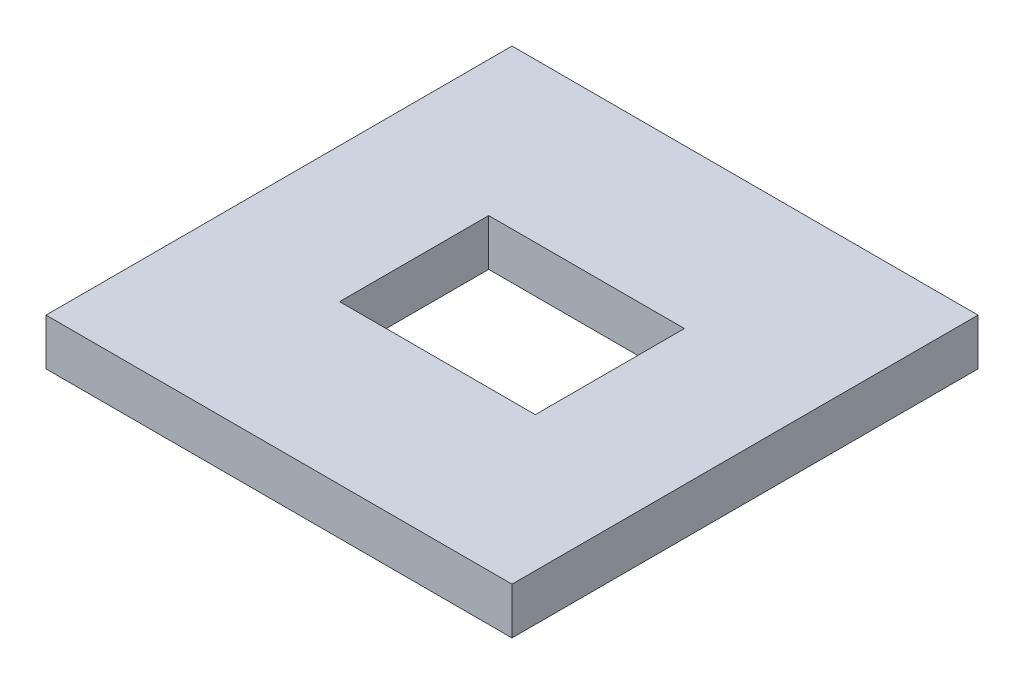
ISO-10303-21;
HEADER;
FILE_DESCRIPTION(('STEP AP214'),'2;1');
FILE_NAME('part.step','',(''),(''),'','','');
FILE_SCHEMA(('AUTOMOTIVE_DESIGN { 1 0 10303 214 1 1 1 1 }'));
ENDSEC;
DATA;
#1=APPLICATION_CONTEXT('core data for automotive mechanical design processes');
#2=APPLICATION_PROTOCOL_DEFINITION('international standard','automotive_design',2000,#1);
#3=PRODUCT_CONTEXT('',#1,'mechanical');
#4=PRODUCT('Part','Part','',(#3));
#5=PRODUCT_RELATED_PRODUCT_CATEGORY('part','',(#4));
#6=PRODUCT_DEFINITION_FORMATION('','',#4);
#7=PRODUCT_DEFINITION_CONTEXT('part definition',#1,'design');
#8=PRODUCT_DEFINITION('design','',#6,#7);
#9=PRODUCT_DEFINITION_SHAPE('','',#8);
#10=(LENGTH_UNIT() NAMED_UNIT(*) SI_UNIT(.MILLI.,.METRE.));
#11=(NAMED_UNIT(*) PLANE_ANGLE_UNIT() SI_UNIT($,.RADIAN.));
#12=(NAMED_UNIT(*) SI_UNIT($,.STERADIAN.) SOLID_ANGLE_UNIT());
#13=UNCERTAINTY_MEASURE_WITH_UNIT(LENGTH_MEASURE(1.E-05),#10,'distance_accuracy_value','');
#14=(GEOMETRIC_REPRESENTATION_CONTEXT(3) GLOBAL_UNCERTAINTY_ASSIGNED_CONTEXT((#13)) GLOBAL_UNIT_ASSIGNED_CONTEXT((#10,
#11,#12)) REPRESENTATION_CONTEXT('',''));
#15=CARTESIAN_POINT('',(0.,0.,0.));
#16=DIRECTION('',(0.,0.,1.));
#17=DIRECTION('',(1.,0.,0.));
#18=AXIS2_PLACEMENT_3D('',#15,#16,#17);
#19=CARTESIAN_POINT('',(0.,5.,0.));
#20=DIRECTION('',(0.,-1.,0.));
#21=DIRECTION('',(0.,0.,-1.));
#22=AXIS2_PLACEMENT_3D('',#19,#20,#21);
#23=PLANE('',#22);
#24=DIRECTION('',(0.,0.,-1.));
#25=VECTOR('',#24,1.);
#26=CARTESIAN_POINT('',(25.,5.,25.));
#27=LINE('',#26,#25);
#28=CARTESIAN_POINT('',(25.,5.,25.));
#29=VERTEX_POINT('',#28);
#30=CARTESIAN_POINT('',(25.,5.,-25.));
#31=VERTEX_POINT('',#30);
#32=EDGE_CURVE('E161',#29,#31,#27,.T.);
#33=ORIENTED_EDGE('',*,*,#32,.T.);
#34=DIRECTION('',(-1.,0.,0.));
#35=VECTOR('',#34,1.);
#36=CARTESIAN_POINT('',(-25.,5.,-25.));
#37=LINE('',#36,#35);
#38=CARTESIAN_POINT('',(-25.,5.,-25.));
#39=VERTEX_POINT('',#38);
#40=EDGE_CURVE('E166',#31,#39,#37,.T.);
#41=ORIENTED_EDGE('',*,*,#40,.T.);
#42=DIRECTION('',(0.,0.,1.));
#43=VECTOR('',#42,1.);
#44=CARTESIAN_POINT('',(-25.,5.,25.));
#45=LINE('',#44,#43);
#46=CARTESIAN_POINT('',(-25.,5.,25.));
#47=VERTEX_POINT('',#46);
#48=EDGE_CURVE('E175',#39,#47,#45,.T.);
#49=ORIENTED_EDGE('',*,*,#48,.T.);
#50=DIRECTION('',(1.,0.,0.));
#51=VECTOR('',#50,1.);
#52=CARTESIAN_POINT('',(-25.,5.,25.));
#53=LINE('',#52,#51);
#54=EDGE_CURVE('E172',#47,#29,#53,.T.);
#55=ORIENTED_EDGE('',*,*,#54,.T.);
#56=EDGE_LOOP('',(#33,#41,#49,#55));
#57=FACE_BOUND('',#56,.T.);
#58=DIRECTION('',(0.,0.,-1.));
#59=VECTOR('',#58,1.);
#60=CARTESIAN_POINT('',(10.5,5.,8.));
#61=LINE('',#60,#59);
#62=CARTESIAN_POINT('',(10.5,5.,8.));
#63=VERTEX_POINT('',#62);
#64=CARTESIAN_POINT('',(10.5,5.,-8.));
#65=VERTEX_POINT('',#64);
#66=EDGE_CURVE('E113',#63,#65,#61,.T.);
#67=ORIENTED_EDGE('',*,*,#66,.F.);
#68=DIRECTION('',(1.,0.,0.));
#69=VECTOR('',#68,1.);
#70=CARTESIAN_POINT('',(-10.5,5.,8.));
#71=LINE('',#70,#69);
#72=CARTESIAN_POINT('',(-10.5,5.,8.));
#73=VERTEX_POINT('',#72);
#74=EDGE_CURVE('E143',#73,#63,#71,.T.);
#75=ORIENTED_EDGE('',*,*,#74,.F.);
#76=DIRECTION('',(0.,0.,1.));
#77=VECTOR('',#76,1.);
#78=CARTESIAN_POINT('',(-10.5,5.,8.));
#79=LINE('',#78,#77);
#80=CARTESIAN_POINT('',(-10.5,5.,-8.));
#81=VERTEX_POINT('',#80);
#82=EDGE_CURVE('E140',#81,#73,#79,.T.);
#83=ORIENTED_EDGE('',*,*,#82,.F.);
#84=DIRECTION('',(-1.,0.,0.));
#85=VECTOR('',#84,1.);
#86=CARTESIAN_POINT('',(-10.5,5.,-8.));
#87=LINE('',#86,#85);
#88=EDGE_CURVE('E125',#65,#81,#87,.T.);
#89=ORIENTED_EDGE('',*,*,#88,.F.);
#90=EDGE_LOOP('',(#67,#75,#83,#89));
#91=FACE_BOUND('',#90,.T.);
#92=ADVANCED_FACE('F47',(#57,#91),#23,.F.);
#93=CARTESIAN_POINT('',(0.,0.,0.));
#94=DIRECTION('',(0.,-1.,0.));
#95=DIRECTION('',(0.,0.,-1.));
#96=AXIS2_PLACEMENT_3D('',#93,#94,#95);
#97=PLANE('',#96);
#98=DIRECTION('',(0.,0.,-1.));
#99=VECTOR('',#98,1.);
#100=CARTESIAN_POINT('',(25.,0.,25.));
#101=LINE('',#100,#99);
#102=CARTESIAN_POINT('',(25.,0.,25.));
#103=VERTEX_POINT('',#102);
#104=CARTESIAN_POINT('',(25.,0.,-25.));
#105=VERTEX_POINT('',#104);
#106=EDGE_CURVE('E133',#103,#105,#101,.T.);
#107=ORIENTED_EDGE('',*,*,#106,.F.);
#108=DIRECTION('',(1.,0.,0.));
#109=VECTOR('',#108,1.);
#110=CARTESIAN_POINT('',(-25.,0.,25.));
#111=LINE('',#110,#109);
#112=CARTESIAN_POINT('',(-25.,0.,25.));
#113=VERTEX_POINT('',#112);
#114=EDGE_CURVE('E170',#113,#103,#111,.T.);
#115=ORIENTED_EDGE('',*,*,#114,.F.);
#116=DIRECTION('',(0.,0.,1.));
#117=VECTOR('',#116,1.);
#118=CARTESIAN_POINT('',(-25.,0.,25.));
#119=LINE('',#118,#117);
#120=CARTESIAN_POINT('',(-25.,0.,-25.));
#121=VERTEX_POINT('',#120);
#122=EDGE_CURVE('E184',#121,#113,#119,.T.);
#123=ORIENTED_EDGE('',*,*,#122,.F.);
#124=DIRECTION('',(-1.,0.,0.));
#125=VECTOR('',#124,1.);
#126=CARTESIAN_POINT('',(-25.,0.,-25.));
#127=LINE('',#126,#125);
#128=EDGE_CURVE('E185',#105,#121,#127,.T.);
#129=ORIENTED_EDGE('',*,*,#128,.F.);
#130=EDGE_LOOP('',(#107,#115,#123,#129));
#131=FACE_BOUND('',#130,.T.);
#132=DIRECTION('',(1.,0.,0.));
#133=VECTOR('',#132,1.);
#134=CARTESIAN_POINT('',(-10.5,0.,8.));
#135=LINE('',#134,#133);
#136=CARTESIAN_POINT('',(-10.5,0.,8.));
#137=VERTEX_POINT('',#136);
#138=CARTESIAN_POINT('',(10.5,0.,8.));
#139=VERTEX_POINT('',#138);
#140=EDGE_CURVE('E124',#137,#139,#135,.T.);
#141=ORIENTED_EDGE('',*,*,#140,.T.);
#142=DIRECTION('',(0.,0.,-1.));
#143=VECTOR('',#142,1.);
#144=CARTESIAN_POINT('',(10.5,0.,8.));
#145=LINE('',#144,#143);
#146=CARTESIAN_POINT('',(10.5,0.,-8.));
#147=VERTEX_POINT('',#146);
#148=EDGE_CURVE('E73',#139,#147,#145,.T.);
#149=ORIENTED_EDGE('',*,*,#148,.T.);
#150=DIRECTION('',(-1.,0.,0.));
#151=VECTOR('',#150,1.);
#152=CARTESIAN_POINT('',(-10.5,0.,-8.));
#153=LINE('',#152,#151);
#154=CARTESIAN_POINT('',(-10.5,0.,-8.));
#155=VERTEX_POINT('',#154);
#156=EDGE_CURVE('E131',#147,#155,#153,.T.);
#157=ORIENTED_EDGE('',*,*,#156,.T.);
#158=DIRECTION('',(0.,0.,1.));
#159=VECTOR('',#158,1.);
#160=CARTESIAN_POINT('',(-10.5,0.,8.));
#161=LINE('',#160,#159);
#162=EDGE_CURVE('E155',#155,#137,#161,.T.);
#163=ORIENTED_EDGE('',*,*,#162,.T.);
#164=EDGE_LOOP('',(#141,#149,#157,#163));
#165=FACE_BOUND('',#164,.T.);
#166=ADVANCED_FACE('F209',(#131,#165),#97,.T.);
#167=CARTESIAN_POINT('',(25.,5.,25.));
#168=DIRECTION('',(-1.,0.,0.));
#169=DIRECTION('',(0.,0.,1.));
#170=AXIS2_PLACEMENT_3D('',#167,#168,#169);
#171=PLANE('',#170);
#172=ORIENTED_EDGE('',*,*,#106,.T.);
#173=DIRECTION('',(0.,-1.,0.));
#174=VECTOR('',#173,1.);
#175=CARTESIAN_POINT('',(25.,5.,-25.));
#176=LINE('',#175,#174);
#177=EDGE_CURVE('E11',#31,#105,#176,.T.);
#178=ORIENTED_EDGE('',*,*,#177,.F.);
#179=ORIENTED_EDGE('',*,*,#32,.F.);
#180=DIRECTION('',(0.,-1.,0.));
#181=VECTOR('',#180,1.);
#182=CARTESIAN_POINT('',(25.,5.,25.));
#183=LINE('',#182,#181);
#184=EDGE_CURVE('E178',#29,#103,#183,.T.);
#185=ORIENTED_EDGE('',*,*,#184,.T.);
#186=EDGE_LOOP('',(#172,#178,#179,#185));
#187=FACE_BOUND('',#186,.T.);
#188=ADVANCED_FACE('F51',(#187),#171,.F.);
#189=CARTESIAN_POINT('',(-25.,5.,-25.));
#190=DIRECTION('',(0.,0.,1.));
#191=DIRECTION('',(1.,0.,0.));
#192=AXIS2_PLACEMENT_3D('',#189,#190,#191);
#193=PLANE('',#192);
#194=ORIENTED_EDGE('',*,*,#128,.T.);
#195=DIRECTION('',(0.,-1.,0.));
#196=VECTOR('',#195,1.);
#197=CARTESIAN_POINT('',(-25.,5.,-25.));
#198=LINE('',#197,#196);
#199=EDGE_CURVE('E59',#39,#121,#198,.T.);
#200=ORIENTED_EDGE('',*,*,#199,.F.);
#201=ORIENTED_EDGE('',*,*,#40,.F.);
#202=ORIENTED_EDGE('',*,*,#177,.T.);
#203=EDGE_LOOP('',(#194,#200,#201,#202));
#204=FACE_BOUND('',#203,.T.);
#205=ADVANCED_FACE('F219',(#204),#193,.F.);
#206=CARTESIAN_POINT('',(-25.,5.,25.));
#207=DIRECTION('',(1.,0.,0.));
#208=DIRECTION('',(0.,0.,-1.));
#209=AXIS2_PLACEMENT_3D('',#206,#207,#208);
#210=PLANE('',#209);
#211=ORIENTED_EDGE('',*,*,#122,.T.);
#212=DIRECTION('',(0.,-1.,0.));
#213=VECTOR('',#212,1.);
#214=CARTESIAN_POINT('',(-25.,5.,25.));
#215=LINE('',#214,#213);
#216=EDGE_CURVE('E194',#47,#113,#215,.T.);
#217=ORIENTED_EDGE('',*,*,#216,.F.);
#218=ORIENTED_EDGE('',*,*,#48,.F.);
#219=ORIENTED_EDGE('',*,*,#199,.T.);
#220=EDGE_LOOP('',(#211,#217,#218,#219));
#221=FACE_BOUND('',#220,.T.);
#222=ADVANCED_FACE('F201',(#221),#210,.F.);
#223=CARTESIAN_POINT('',(-25.,5.,25.));
#224=DIRECTION('',(0.,0.,-1.));
#225=DIRECTION('',(-1.,0.,0.));
#226=AXIS2_PLACEMENT_3D('',#223,#224,#225);
#227=PLANE('',#226);
#228=ORIENTED_EDGE('',*,*,#114,.T.);
#229=ORIENTED_EDGE('',*,*,#184,.F.);
#230=ORIENTED_EDGE('',*,*,#54,.F.);
#231=ORIENTED_EDGE('',*,*,#216,.T.);
#232=EDGE_LOOP('',(#228,#229,#230,#231));
#233=FACE_BOUND('',#232,.T.);
#234=ADVANCED_FACE('F211',(#233),#227,.F.);
#235=CARTESIAN_POINT('',(10.5,5.,8.));
#236=DIRECTION('',(-1.,0.,0.));
#237=DIRECTION('',(0.,0.,1.));
#238=AXIS2_PLACEMENT_3D('',#235,#236,#237);
#239=PLANE('',#238);
#240=ORIENTED_EDGE('',*,*,#148,.F.);
#241=DIRECTION('',(0.,-1.,0.));
#242=VECTOR('',#241,1.);
#243=CARTESIAN_POINT('',(10.5,5.,8.));
#244=LINE('',#243,#242);
#245=EDGE_CURVE('E119',#63,#139,#244,.T.);
#246=ORIENTED_EDGE('',*,*,#245,.F.);
#247=ORIENTED_EDGE('',*,*,#66,.T.);
#248=DIRECTION('',(0.,-1.,0.));
#249=VECTOR('',#248,1.);
#250=CARTESIAN_POINT('',(10.5,5.,-8.));
#251=LINE('',#250,#249);
#252=EDGE_CURVE('E118',#65,#147,#251,.T.);
#253=ORIENTED_EDGE('',*,*,#252,.T.);
#254=EDGE_LOOP('',(#240,#246,#247,#253));
#255=FACE_BOUND('',#254,.T.);
#256=ADVANCED_FACE('F120',(#255),#239,.T.);
#257=CARTESIAN_POINT('',(-10.5,5.,-8.));
#258=DIRECTION('',(0.,0.,1.));
#259=DIRECTION('',(1.,0.,0.));
#260=AXIS2_PLACEMENT_3D('',#257,#258,#259);
#261=PLANE('',#260);
#262=ORIENTED_EDGE('',*,*,#156,.F.);
#263=ORIENTED_EDGE('',*,*,#252,.F.);
#264=ORIENTED_EDGE('',*,*,#88,.T.);
#265=DIRECTION('',(0.,-1.,0.));
#266=VECTOR('',#265,1.);
#267=CARTESIAN_POINT('',(-10.5,5.,-8.));
#268=LINE('',#267,#266);
#269=EDGE_CURVE('E132',#81,#155,#268,.T.);
#270=ORIENTED_EDGE('',*,*,#269,.T.);
#271=EDGE_LOOP('',(#262,#263,#264,#270));
#272=FACE_BOUND('',#271,.T.);
#273=ADVANCED_FACE('F126',(#272),#261,.T.);
#274=CARTESIAN_POINT('',(-10.5,5.,8.));
#275=DIRECTION('',(1.,0.,0.));
#276=DIRECTION('',(0.,0.,-1.));
#277=AXIS2_PLACEMENT_3D('',#274,#275,#276);
#278=PLANE('',#277);
#279=ORIENTED_EDGE('',*,*,#162,.F.);
#280=ORIENTED_EDGE('',*,*,#269,.F.);
#281=ORIENTED_EDGE('',*,*,#82,.T.);
#282=DIRECTION('',(0.,-1.,0.));
#283=VECTOR('',#282,1.);
#284=CARTESIAN_POINT('',(-10.5,5.,8.));
#285=LINE('',#284,#283);
#286=EDGE_CURVE('E61',#73,#137,#285,.T.);
#287=ORIENTED_EDGE('',*,*,#286,.T.);
#288=EDGE_LOOP('',(#279,#280,#281,#287));
#289=FACE_BOUND('',#288,.T.);
#290=ADVANCED_FACE('F239',(#289),#278,.T.);
#291=CARTESIAN_POINT('',(-10.5,5.,8.));
#292=DIRECTION('',(0.,0.,-1.));
#293=DIRECTION('',(-1.,0.,0.));
#294=AXIS2_PLACEMENT_3D('',#291,#292,#293);
#295=PLANE('',#294);
#296=ORIENTED_EDGE('',*,*,#140,.F.);
#297=ORIENTED_EDGE('',*,*,#286,.F.);
#298=ORIENTED_EDGE('',*,*,#74,.T.);
#299=ORIENTED_EDGE('',*,*,#245,.T.);
#300=EDGE_LOOP('',(#296,#297,#298,#299));
#301=FACE_BOUND('',#300,.T.);
#302=ADVANCED_FACE('F242',(#301),#295,.T.);
#303=CLOSED_SHELL('',(#92,#166,#188,#205,#222,#234,#256,#273,#290,#302));
#304=MANIFOLD_SOLID_BREP('B2',#303);
#305=ADVANCED_BREP_SHAPE_REPRESENTATION('',(#18,#304),#14);
#306=SHAPE_DEFINITION_REPRESENTATION(#9,#305);
ENDSEC;
END-ISO-10303-21;
